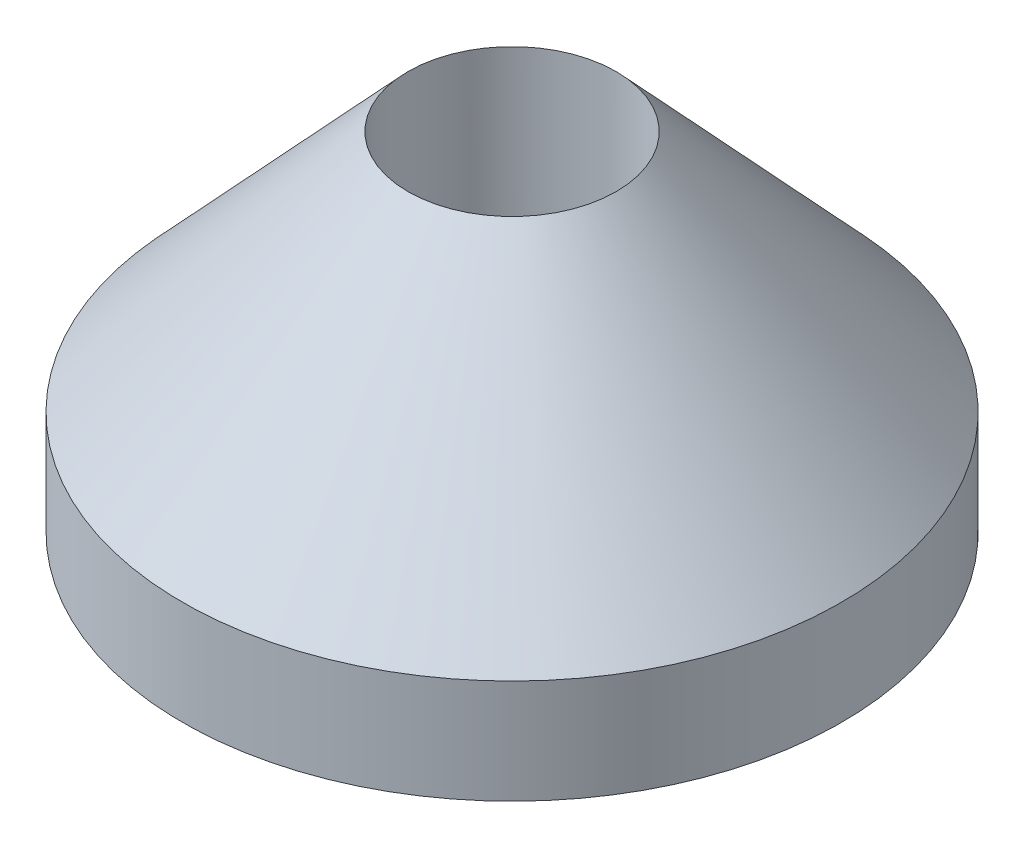
ISO-10303-21;
HEADER;
FILE_DESCRIPTION(('STEP AP214'),'2;1');
FILE_NAME('part.step','',(''),(''),'','','');
FILE_SCHEMA(('AUTOMOTIVE_DESIGN { 1 0 10303 214 1 1 1 1 }'));
ENDSEC;
DATA;
#1=APPLICATION_CONTEXT('core data for automotive mechanical design processes');
#2=APPLICATION_PROTOCOL_DEFINITION('international standard','automotive_design',2000,#1);
#3=PRODUCT_CONTEXT('',#1,'mechanical');
#4=PRODUCT('Part','Part','',(#3));
#5=PRODUCT_RELATED_PRODUCT_CATEGORY('part','',(#4));
#6=PRODUCT_DEFINITION_FORMATION('','',#4);
#7=PRODUCT_DEFINITION_CONTEXT('part definition',#1,'design');
#8=PRODUCT_DEFINITION('design','',#6,#7);
#9=PRODUCT_DEFINITION_SHAPE('','',#8);
#10=(LENGTH_UNIT() NAMED_UNIT(*) SI_UNIT(.MILLI.,.METRE.));
#11=(NAMED_UNIT(*) PLANE_ANGLE_UNIT() SI_UNIT($,.RADIAN.));
#12=(NAMED_UNIT(*) SI_UNIT($,.STERADIAN.) SOLID_ANGLE_UNIT());
#13=UNCERTAINTY_MEASURE_WITH_UNIT(LENGTH_MEASURE(1.E-05),#10,'distance_accuracy_value','');
#14=(GEOMETRIC_REPRESENTATION_CONTEXT(3) GLOBAL_UNCERTAINTY_ASSIGNED_CONTEXT((#13)) GLOBAL_UNIT_ASSIGNED_CONTEXT((#10,
#11,#12)) REPRESENTATION_CONTEXT('',''));
#15=CARTESIAN_POINT('',(0.,0.,0.));
#16=DIRECTION('',(0.,0.,1.));
#17=DIRECTION('',(1.,0.,0.));
#18=AXIS2_PLACEMENT_3D('',#15,#16,#17);
#19=CARTESIAN_POINT('',(0.,0.587634079347699,0.));
#20=DIRECTION('',(0.,-1.,0.));
#21=DIRECTION('',(0.,0.,-1.));
#22=AXIS2_PLACEMENT_3D('',#19,#20,#21);
#23=PLANE('',#22);
#24=CARTESIAN_POINT('',(0.,0.587634079347699,0.));
#25=DIRECTION('',(0.,-1.,0.));
#26=DIRECTION('',(0.,0.,-1.));
#27=AXIS2_PLACEMENT_3D('',#24,#25,#26);
#28=CIRCLE('',#27,9.5);
#29=CARTESIAN_POINT('',(0.,0.587634079347699,-9.5));
#30=VERTEX_POINT('',#29);
#31=EDGE_CURVE('E10',#30,#30,#28,.T.);
#32=ORIENTED_EDGE('',*,*,#31,.T.);
#33=EDGE_LOOP('',(#32));
#34=FACE_BOUND('',#33,.T.);
#35=ADVANCED_FACE('F37',(#34),#23,.T.);
#36=CARTESIAN_POINT('',(0.,0.587634079347699,0.));
#37=DIRECTION('',(0.,-1.,0.));
#38=DIRECTION('',(0.,0.,-1.));
#39=AXIS2_PLACEMENT_3D('',#36,#37,#38);
#40=CYLINDRICAL_SURFACE('',#39,9.5);
#41=CARTESIAN_POINT('',(0.,3.5876340793477,0.));
#42=DIRECTION('',(0.,-1.,0.));
#43=DIRECTION('',(0.,0.,-1.));
#44=AXIS2_PLACEMENT_3D('',#41,#42,#43);
#45=CIRCLE('',#44,9.5);
#46=CARTESIAN_POINT('',(0.,3.5876340793477,-9.5));
#47=VERTEX_POINT('',#46);
#48=EDGE_CURVE('E44',#47,#47,#45,.T.);
#49=ORIENTED_EDGE('',*,*,#48,.T.);
#50=EDGE_LOOP('',(#49));
#51=FACE_BOUND('',#50,.T.);
#52=ORIENTED_EDGE('',*,*,#31,.F.);
#53=EDGE_LOOP('',(#52));
#54=FACE_BOUND('',#53,.T.);
#55=ADVANCED_FACE('F66',(#51,#54),#40,.T.);
#56=CARTESIAN_POINT('',(0.,3.5876340793477,0.));
#57=DIRECTION('',(0.,-1.,0.));
#58=DIRECTION('',(0.,0.,-1.));
#59=AXIS2_PLACEMENT_3D('',#56,#57,#58);
#60=CONICAL_SURFACE('',#59,9.5,0.748378047523518);
#61=CARTESIAN_POINT('',(0.,10.5876340793477,0.));
#62=DIRECTION('',(0.,1.,0.));
#63=DIRECTION('',(0.,0.,1.));
#64=AXIS2_PLACEMENT_3D('',#61,#62,#63);
#65=CIRCLE('',#64,3.);
#66=CARTESIAN_POINT('',(0.,10.5876340793477,-3.));
#67=VERTEX_POINT('',#66);
#68=EDGE_CURVE('E54',#67,#67,#65,.T.);
#69=CARTESIAN_POINT('',(0.,10.5876340793477,-3.));
#70=CARTESIAN_POINT('',(0.,10.514717412681,-3.06770833333334));
#71=CARTESIAN_POINT('',(0.,10.4418007460144,-3.13541666666667));
#72=CARTESIAN_POINT('',(0.,10.295967412681,-3.27083333333334));
#73=CARTESIAN_POINT('',(0.,10.2230507460144,-3.33854166666667));
#74=CARTESIAN_POINT('',(0.,10.077217412681,-3.47395833333334));
#75=CARTESIAN_POINT('',(0.,10.0043007460144,-3.54166666666667));
#76=CARTESIAN_POINT('',(0.,9.85846741268103,-3.67708333333334));
#77=CARTESIAN_POINT('',(0.,9.78555074601437,-3.74479166666667));
#78=CARTESIAN_POINT('',(0.,9.63971741268103,-3.88020833333333));
#79=CARTESIAN_POINT('',(0.,9.56680074601437,-3.94791666666667));
#80=CARTESIAN_POINT('',(0.,9.42096741268103,-4.08333333333333));
#81=CARTESIAN_POINT('',(0.,9.34805074601437,-4.15104166666667));
#82=CARTESIAN_POINT('',(0.,9.20221741268103,-4.28645833333333));
#83=CARTESIAN_POINT('',(0.,9.12930074601437,-4.35416666666667));
#84=CARTESIAN_POINT('',(0.,8.98346741268103,-4.48958333333333));
#85=CARTESIAN_POINT('',(0.,8.91055074601437,-4.55729166666667));
#86=CARTESIAN_POINT('',(0.,8.76471741268103,-4.69270833333333));
#87=CARTESIAN_POINT('',(0.,8.69180074601437,-4.76041666666667));
#88=CARTESIAN_POINT('',(0.,8.54596741268103,-4.89583333333333));
#89=CARTESIAN_POINT('',(0.,8.47305074601437,-4.96354166666667));
#90=CARTESIAN_POINT('',(0.,8.32721741268103,-5.09895833333333));
#91=CARTESIAN_POINT('',(0.,8.25430074601437,-5.16666666666667));
#92=CARTESIAN_POINT('',(0.,8.10846741268103,-5.30208333333333));
#93=CARTESIAN_POINT('',(0.,8.03555074601437,-5.36979166666667));
#94=CARTESIAN_POINT('',(0.,7.88971741268103,-5.50520833333333));
#95=CARTESIAN_POINT('',(0.,7.81680074601437,-5.57291666666667));
#96=CARTESIAN_POINT('',(0.,7.67096741268103,-5.70833333333333));
#97=CARTESIAN_POINT('',(0.,7.59805074601437,-5.77604166666667));
#98=CARTESIAN_POINT('',(0.,7.45221741268103,-5.91145833333333));
#99=CARTESIAN_POINT('',(0.,7.37930074601437,-5.97916666666667));
#100=CARTESIAN_POINT('',(0.,7.23346741268103,-6.11458333333333));
#101=CARTESIAN_POINT('',(0.,7.16055074601437,-6.18229166666667));
#102=CARTESIAN_POINT('',(0.,7.01471741268103,-6.31770833333333));
#103=CARTESIAN_POINT('',(0.,6.94180074601437,-6.38541666666667));
#104=CARTESIAN_POINT('',(0.,6.79596741268103,-6.52083333333333));
#105=CARTESIAN_POINT('',(0.,6.72305074601437,-6.58854166666667));
#106=CARTESIAN_POINT('',(0.,6.57721741268103,-6.72395833333333));
#107=CARTESIAN_POINT('',(0.,6.50430074601437,-6.79166666666667));
#108=CARTESIAN_POINT('',(0.,6.35846741268103,-6.92708333333333));
#109=CARTESIAN_POINT('',(0.,6.28555074601437,-6.99479166666667));
#110=CARTESIAN_POINT('',(0.,6.13971741268103,-7.13020833333333));
#111=CARTESIAN_POINT('',(0.,6.06680074601437,-7.19791666666667));
#112=CARTESIAN_POINT('',(0.,5.92096741268103,-7.33333333333333));
#113=CARTESIAN_POINT('',(0.,5.84805074601437,-7.40104166666667));
#114=CARTESIAN_POINT('',(0.,5.70221741268103,-7.53645833333333));
#115=CARTESIAN_POINT('',(0.,5.62930074601437,-7.60416666666667));
#116=CARTESIAN_POINT('',(0.,5.48346741268103,-7.73958333333333));
#117=CARTESIAN_POINT('',(0.,5.41055074601436,-7.80729166666667));
#118=CARTESIAN_POINT('',(0.,5.26471741268103,-7.94270833333333));
#119=CARTESIAN_POINT('',(0.,5.19180074601437,-8.01041666666667));
#120=CARTESIAN_POINT('',(0.,5.04596741268103,-8.14583333333333));
#121=CARTESIAN_POINT('',(0.,4.97305074601437,-8.21354166666667));
#122=CARTESIAN_POINT('',(0.,4.82721741268103,-8.34895833333333));
#123=CARTESIAN_POINT('',(0.,4.75430074601437,-8.41666666666667));
#124=CARTESIAN_POINT('',(0.,4.60846741268103,-8.55208333333333));
#125=CARTESIAN_POINT('',(0.,4.53555074601436,-8.61979166666667));
#126=CARTESIAN_POINT('',(0.,4.38971741268103,-8.75520833333333));
#127=CARTESIAN_POINT('',(0.,4.31680074601436,-8.82291666666667));
#128=CARTESIAN_POINT('',(0.,4.17096741268103,-8.95833333333333));
#129=CARTESIAN_POINT('',(0.,4.09805074601437,-9.02604166666667));
#130=CARTESIAN_POINT('',(0.,3.95221741268103,-9.16145833333333));
#131=CARTESIAN_POINT('',(0.,3.87930074601437,-9.22916666666667));
#132=CARTESIAN_POINT('',(0.,3.73346741268103,-9.36458333333333));
#133=CARTESIAN_POINT('',(0.,3.66055074601437,-9.43229166666667));
#134=CARTESIAN_POINT('',(0.,3.5876340793477,-9.5));
#135=B_SPLINE_CURVE_WITH_KNOTS('',3,(#69,#70,#71,#72,#73,#74,#75,#76,#77,#78,#79,#80,#81,#82,
#83,#84,#85,#86,#87,#88,#89,#90,#91,#92,#93,#94,#95,#96,#97,#98,#99,#100,#101,#102,#103,#104,
#105,#106,#107,#108,#109,#110,#111,#112,#113,#114,#115,#116,#117,#118,#119,#120,#121,#122,#123,
#124,#125,#126,#127,#128,#129,#130,#131,#132,#133,#134),.UNSPECIFIED.,.F.,.F.,(4,2,2,2,2,2,2,2,
2,2,2,2,2,2,2,2,2,2,2,2,2,2,2,2,2,2,2,2,2,2,2,2,4),(0.,0.298515205852231,0.597030411704463,
0.895545617556694,1.19406082340893,1.49257602926116,1.79109123511339,2.08960644096562,
2.38812164681785,2.68663685267008,2.98515205852231,3.28366726437454,3.58218247022678,
3.88069767607901,4.17921288193124,4.47772808778347,4.7762432936357,5.07475849948793,
5.37327370534016,5.67178891119239,5.97030411704462,6.26881932289685,6.56733452874909,
6.86584973460132,7.16436494045355,7.46288014630578,7.76139535215801,8.05991055801024,
8.35842576386247,8.65694096971471,8.95545617556694,9.25397138141917,9.5524865872714),.UNSPECIFIED.);
#136=EDGE_CURVE('BSEAM63',#67,#47,#135,.T.);
#137=ORIENTED_EDGE('',*,*,#68,.F.);
#138=ORIENTED_EDGE('',*,*,#48,.F.);
#139=ORIENTED_EDGE('',*,*,#136,.T.);
#140=ORIENTED_EDGE('',*,*,#136,.F.);
#141=EDGE_LOOP('',(#137,#139,#138,#140));
#142=FACE_BOUND('',#141,.T.);
#143=ADVANCED_FACE('F63',(#142),#60,.T.);
#144=CARTESIAN_POINT('',(0.,3.5876340793477,0.));
#145=DIRECTION('',(0.,1.,0.));
#146=DIRECTION('',(0.,0.,1.));
#147=AXIS2_PLACEMENT_3D('',#144,#145,#146);
#148=CYLINDRICAL_SURFACE('',#147,3.);
#149=CARTESIAN_POINT('',(0.,3.5876340793477,0.));
#150=DIRECTION('',(0.,1.,0.));
#151=DIRECTION('',(0.,0.,1.));
#152=AXIS2_PLACEMENT_3D('',#149,#150,#151);
#153=CIRCLE('',#152,3.);
#154=CARTESIAN_POINT('',(0.,3.5876340793477,3.));
#155=VERTEX_POINT('',#154);
#156=EDGE_CURVE('E49',#155,#155,#153,.T.);
#157=ORIENTED_EDGE('',*,*,#156,.F.);
#158=EDGE_LOOP('',(#157));
#159=FACE_BOUND('',#158,.T.);
#160=ORIENTED_EDGE('',*,*,#68,.T.);
#161=EDGE_LOOP('',(#160));
#162=FACE_BOUND('',#161,.T.);
#163=ADVANCED_FACE('F61',(#159,#162),#148,.F.);
#164=CARTESIAN_POINT('',(0.,3.5876340793477,0.));
#165=DIRECTION('',(0.,1.,0.));
#166=DIRECTION('',(0.,0.,1.));
#167=AXIS2_PLACEMENT_3D('',#164,#165,#166);
#168=PLANE('',#167);
#169=ORIENTED_EDGE('',*,*,#156,.T.);
#170=EDGE_LOOP('',(#169));
#171=FACE_BOUND('',#170,.T.);
#172=ADVANCED_FACE('F72',(#171),#168,.T.);
#173=CLOSED_SHELL('',(#35,#55,#143,#163,#172));
#174=MANIFOLD_SOLID_BREP('B2',#173);
#175=ADVANCED_BREP_SHAPE_REPRESENTATION('',(#18,#174),#14);
#176=SHAPE_DEFINITION_REPRESENTATION(#9,#175);
ENDSEC;
END-ISO-10303-21;
